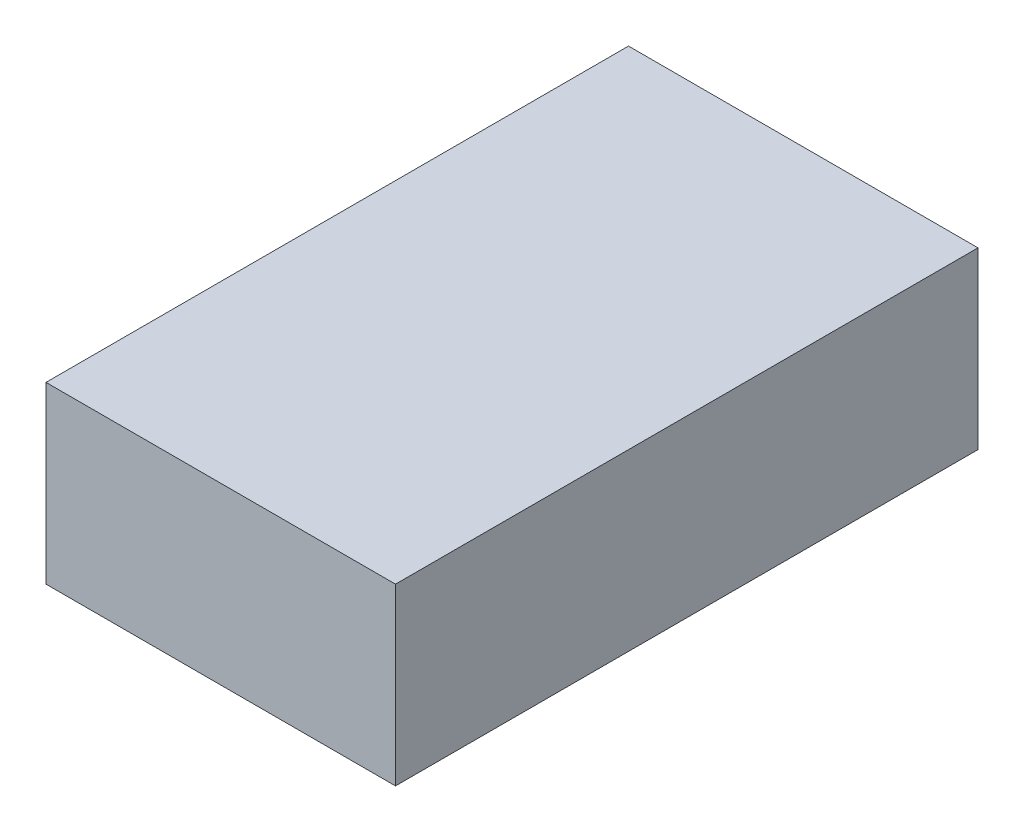
ISO-10303-21;
HEADER;
FILE_DESCRIPTION(('STEP AP214'),'2;1');
FILE_NAME('part.step','',(''),(''),'','','');
FILE_SCHEMA(('AUTOMOTIVE_DESIGN { 1 0 10303 214 1 1 1 1 }'));
ENDSEC;
DATA;
#1=APPLICATION_CONTEXT('core data for automotive mechanical design processes');
#2=APPLICATION_PROTOCOL_DEFINITION('international standard','automotive_design',2000,#1);
#3=PRODUCT_CONTEXT('',#1,'mechanical');
#4=PRODUCT('Part','Part','',(#3));
#5=PRODUCT_RELATED_PRODUCT_CATEGORY('part','',(#4));
#6=PRODUCT_DEFINITION_FORMATION('','',#4);
#7=PRODUCT_DEFINITION_CONTEXT('part definition',#1,'design');
#8=PRODUCT_DEFINITION('design','',#6,#7);
#9=PRODUCT_DEFINITION_SHAPE('','',#8);
#10=(LENGTH_UNIT() NAMED_UNIT(*) SI_UNIT(.MILLI.,.METRE.));
#11=(NAMED_UNIT(*) PLANE_ANGLE_UNIT() SI_UNIT($,.RADIAN.));
#12=(NAMED_UNIT(*) SI_UNIT($,.STERADIAN.) SOLID_ANGLE_UNIT());
#13=UNCERTAINTY_MEASURE_WITH_UNIT(LENGTH_MEASURE(1.E-05),#10,'distance_accuracy_value','');
#14=(GEOMETRIC_REPRESENTATION_CONTEXT(3) GLOBAL_UNCERTAINTY_ASSIGNED_CONTEXT((#13)) GLOBAL_UNIT_ASSIGNED_CONTEXT((#10,
#11,#12)) REPRESENTATION_CONTEXT('',''));
#15=CARTESIAN_POINT('',(0.,0.,0.));
#16=DIRECTION('',(0.,0.,1.));
#17=DIRECTION('',(1.,0.,0.));
#18=AXIS2_PLACEMENT_3D('',#15,#16,#17);
#19=CARTESIAN_POINT('',(-10.0819672131147,1.79508196721311,10.));
#20=DIRECTION('',(1.,0.,0.));
#21=DIRECTION('',(0.,0.,-1.));
#22=AXIS2_PLACEMENT_3D('',#19,#20,#21);
#23=PLANE('',#22);
#24=DIRECTION('',(0.,-1.,0.));
#25=VECTOR('',#24,1.);
#26=CARTESIAN_POINT('',(-10.0819672131147,1.79508196721311,0.));
#27=LINE('',#26,#25);
#28=CARTESIAN_POINT('',(-10.0819672131147,1.79508196721311,0.));
#29=VERTEX_POINT('',#28);
#30=CARTESIAN_POINT('',(-10.0819672131147,-1.20491803278689,0.));
#31=VERTEX_POINT('',#30);
#32=EDGE_CURVE('E96',#29,#31,#27,.T.);
#33=ORIENTED_EDGE('',*,*,#32,.T.);
#34=DIRECTION('',(0.,0.,-1.));
#35=VECTOR('',#34,1.);
#36=CARTESIAN_POINT('',(-10.0819672131147,-1.20491803278689,10.));
#37=LINE('',#36,#35);
#38=CARTESIAN_POINT('',(-10.0819672131147,-1.20491803278689,10.));
#39=VERTEX_POINT('',#38);
#40=EDGE_CURVE('E11',#39,#31,#37,.T.);
#41=ORIENTED_EDGE('',*,*,#40,.F.);
#42=DIRECTION('',(0.,-1.,0.));
#43=VECTOR('',#42,1.);
#44=CARTESIAN_POINT('',(-10.0819672131147,1.79508196721311,10.));
#45=LINE('',#44,#43);
#46=CARTESIAN_POINT('',(-10.0819672131147,1.79508196721311,10.));
#47=VERTEX_POINT('',#46);
#48=EDGE_CURVE('E84',#47,#39,#45,.T.);
#49=ORIENTED_EDGE('',*,*,#48,.F.);
#50=DIRECTION('',(0.,0.,-1.));
#51=VECTOR('',#50,1.);
#52=CARTESIAN_POINT('',(-10.0819672131147,1.79508196721311,10.));
#53=LINE('',#52,#51);
#54=EDGE_CURVE('E92',#47,#29,#53,.T.);
#55=ORIENTED_EDGE('',*,*,#54,.T.);
#56=EDGE_LOOP('',(#33,#41,#49,#55));
#57=FACE_BOUND('',#56,.T.);
#58=ADVANCED_FACE('F33',(#57),#23,.F.);
#59=CARTESIAN_POINT('',(-10.0819672131147,-1.20491803278689,10.));
#60=DIRECTION('',(0.,1.,0.));
#61=DIRECTION('',(0.,0.,1.));
#62=AXIS2_PLACEMENT_3D('',#59,#60,#61);
#63=PLANE('',#62);
#64=DIRECTION('',(1.,0.,0.));
#65=VECTOR('',#64,1.);
#66=CARTESIAN_POINT('',(-10.0819672131147,-1.20491803278689,0.));
#67=LINE('',#66,#65);
#68=CARTESIAN_POINT('',(-4.08196721311475,-1.20491803278689,0.));
#69=VERTEX_POINT('',#68);
#70=EDGE_CURVE('E88',#31,#69,#67,.T.);
#71=ORIENTED_EDGE('',*,*,#70,.T.);
#72=DIRECTION('',(0.,0.,-1.));
#73=VECTOR('',#72,1.);
#74=CARTESIAN_POINT('',(-4.08196721311475,-1.20491803278689,10.));
#75=LINE('',#74,#73);
#76=CARTESIAN_POINT('',(-4.08196721311475,-1.20491803278689,10.));
#77=VERTEX_POINT('',#76);
#78=EDGE_CURVE('E41',#77,#69,#75,.T.);
#79=ORIENTED_EDGE('',*,*,#78,.F.);
#80=DIRECTION('',(1.,0.,0.));
#81=VECTOR('',#80,1.);
#82=CARTESIAN_POINT('',(-10.0819672131147,-1.20491803278689,10.));
#83=LINE('',#82,#81);
#84=EDGE_CURVE('E79',#39,#77,#83,.T.);
#85=ORIENTED_EDGE('',*,*,#84,.F.);
#86=ORIENTED_EDGE('',*,*,#40,.T.);
#87=EDGE_LOOP('',(#71,#79,#85,#86));
#88=FACE_BOUND('',#87,.T.);
#89=ADVANCED_FACE('F87',(#88),#63,.F.);
#90=CARTESIAN_POINT('',(-4.08196721311475,1.79508196721311,10.));
#91=DIRECTION('',(-1.,0.,0.));
#92=DIRECTION('',(0.,0.,1.));
#93=AXIS2_PLACEMENT_3D('',#90,#91,#92);
#94=PLANE('',#93);
#95=DIRECTION('',(0.,1.,0.));
#96=VECTOR('',#95,1.);
#97=CARTESIAN_POINT('',(-4.08196721311475,1.79508196721311,0.));
#98=LINE('',#97,#96);
#99=CARTESIAN_POINT('',(-4.08196721311475,1.79508196721311,0.));
#100=VERTEX_POINT('',#99);
#101=EDGE_CURVE('E66',#69,#100,#98,.T.);
#102=ORIENTED_EDGE('',*,*,#101,.T.);
#103=DIRECTION('',(0.,0.,-1.));
#104=VECTOR('',#103,1.);
#105=CARTESIAN_POINT('',(-4.08196721311475,1.79508196721311,10.));
#106=LINE('',#105,#104);
#107=CARTESIAN_POINT('',(-4.08196721311475,1.79508196721311,10.));
#108=VERTEX_POINT('',#107);
#109=EDGE_CURVE('E89',#108,#100,#106,.T.);
#110=ORIENTED_EDGE('',*,*,#109,.F.);
#111=DIRECTION('',(0.,1.,0.));
#112=VECTOR('',#111,1.);
#113=CARTESIAN_POINT('',(-4.08196721311475,1.79508196721311,10.));
#114=LINE('',#113,#112);
#115=EDGE_CURVE('E82',#77,#108,#114,.T.);
#116=ORIENTED_EDGE('',*,*,#115,.F.);
#117=ORIENTED_EDGE('',*,*,#78,.T.);
#118=EDGE_LOOP('',(#102,#110,#116,#117));
#119=FACE_BOUND('',#118,.T.);
#120=ADVANCED_FACE('F90',(#119),#94,.F.);
#121=CARTESIAN_POINT('',(-10.0819672131147,1.79508196721311,10.));
#122=DIRECTION('',(0.,-1.,0.));
#123=DIRECTION('',(0.,0.,-1.));
#124=AXIS2_PLACEMENT_3D('',#121,#122,#123);
#125=PLANE('',#124);
#126=DIRECTION('',(-1.,0.,0.));
#127=VECTOR('',#126,1.);
#128=CARTESIAN_POINT('',(-10.0819672131147,1.79508196721311,0.));
#129=LINE('',#128,#127);
#130=EDGE_CURVE('E72',#100,#29,#129,.T.);
#131=ORIENTED_EDGE('',*,*,#130,.T.);
#132=ORIENTED_EDGE('',*,*,#54,.F.);
#133=DIRECTION('',(-1.,0.,0.));
#134=VECTOR('',#133,1.);
#135=CARTESIAN_POINT('',(-10.0819672131147,1.79508196721311,10.));
#136=LINE('',#135,#134);
#137=EDGE_CURVE('E49',#108,#47,#136,.T.);
#138=ORIENTED_EDGE('',*,*,#137,.F.);
#139=ORIENTED_EDGE('',*,*,#109,.T.);
#140=EDGE_LOOP('',(#131,#132,#138,#139));
#141=FACE_BOUND('',#140,.T.);
#142=ADVANCED_FACE('F103',(#141),#125,.F.);
#143=CARTESIAN_POINT('',(0.,0.,10.));
#144=DIRECTION('',(0.,0.,1.));
#145=DIRECTION('',(1.,0.,0.));
#146=AXIS2_PLACEMENT_3D('',#143,#144,#145);
#147=PLANE('',#146);
#148=ORIENTED_EDGE('',*,*,#48,.T.);
#149=ORIENTED_EDGE('',*,*,#84,.T.);
#150=ORIENTED_EDGE('',*,*,#115,.T.);
#151=ORIENTED_EDGE('',*,*,#137,.T.);
#152=EDGE_LOOP('',(#148,#149,#150,#151));
#153=FACE_BOUND('',#152,.T.);
#154=ADVANCED_FACE('F80',(#153),#147,.T.);
#155=CARTESIAN_POINT('',(0.,0.,0.));
#156=DIRECTION('',(0.,0.,1.));
#157=DIRECTION('',(1.,0.,0.));
#158=AXIS2_PLACEMENT_3D('',#155,#156,#157);
#159=PLANE('',#158);
#160=ORIENTED_EDGE('',*,*,#32,.F.);
#161=ORIENTED_EDGE('',*,*,#130,.F.);
#162=ORIENTED_EDGE('',*,*,#101,.F.);
#163=ORIENTED_EDGE('',*,*,#70,.F.);
#164=EDGE_LOOP('',(#160,#161,#162,#163));
#165=FACE_BOUND('',#164,.T.);
#166=ADVANCED_FACE('F106',(#165),#159,.F.);
#167=CLOSED_SHELL('',(#58,#89,#120,#142,#154,#166));
#168=MANIFOLD_SOLID_BREP('B2',#167);
#169=ADVANCED_BREP_SHAPE_REPRESENTATION('',(#18,#168),#14);
#170=SHAPE_DEFINITION_REPRESENTATION(#9,#169);
ENDSEC;
END-ISO-10303-21;
